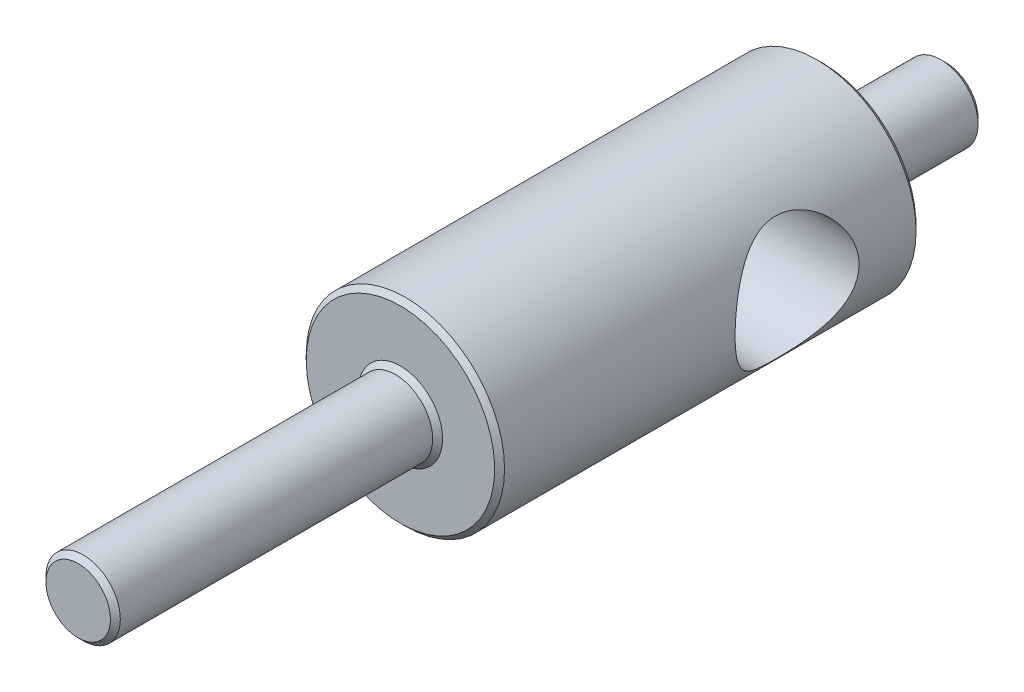
ISO-10303-21;
HEADER;
FILE_DESCRIPTION(('STEP AP214'),'2;1');
FILE_NAME('part.step','',(''),(''),'','','');
FILE_SCHEMA(('AUTOMOTIVE_DESIGN { 1 0 10303 214 1 1 1 1 }'));
ENDSEC;
DATA;
#1=APPLICATION_CONTEXT('core data for automotive mechanical design processes');
#2=APPLICATION_PROTOCOL_DEFINITION('international standard','automotive_design',2000,#1);
#3=PRODUCT_CONTEXT('',#1,'mechanical');
#4=PRODUCT('Part','Part','',(#3));
#5=PRODUCT_RELATED_PRODUCT_CATEGORY('part','',(#4));
#6=PRODUCT_DEFINITION_FORMATION('','',#4);
#7=PRODUCT_DEFINITION_CONTEXT('part definition',#1,'design');
#8=PRODUCT_DEFINITION('design','',#6,#7);
#9=PRODUCT_DEFINITION_SHAPE('','',#8);
#10=(LENGTH_UNIT() NAMED_UNIT(*) SI_UNIT(.MILLI.,.METRE.));
#11=(NAMED_UNIT(*) PLANE_ANGLE_UNIT() SI_UNIT($,.RADIAN.));
#12=(NAMED_UNIT(*) SI_UNIT($,.STERADIAN.) SOLID_ANGLE_UNIT());
#13=UNCERTAINTY_MEASURE_WITH_UNIT(LENGTH_MEASURE(1.E-05),#10,'distance_accuracy_value','');
#14=(GEOMETRIC_REPRESENTATION_CONTEXT(3) GLOBAL_UNCERTAINTY_ASSIGNED_CONTEXT((#13)) GLOBAL_UNIT_ASSIGNED_CONTEXT((#10,
#11,#12)) REPRESENTATION_CONTEXT('',''));
#15=CARTESIAN_POINT('',(0.,0.,0.));
#16=DIRECTION('',(0.,0.,1.));
#17=DIRECTION('',(1.,0.,0.));
#18=AXIS2_PLACEMENT_3D('',#15,#16,#17);
#19=CARTESIAN_POINT('',(0.,0.,-13.));
#20=DIRECTION('',(0.,0.,1.));
#21=DIRECTION('',(1.,0.,0.));
#22=AXIS2_PLACEMENT_3D('',#19,#20,#21);
#23=CYLINDRICAL_SURFACE('',#22,1.5);
#24=CARTESIAN_POINT('',(0.,0.,-12.8));
#25=DIRECTION('',(0.,0.,-1.));
#26=DIRECTION('',(-1.,0.,0.));
#27=AXIS2_PLACEMENT_3D('',#24,#25,#26);
#28=CIRCLE('',#27,1.5);
#29=CARTESIAN_POINT('',(1.5,0.,-12.8));
#30=VERTEX_POINT('',#29);
#31=EDGE_CURVE('E53',#30,#30,#28,.F.);
#32=CARTESIAN_POINT('',(0.,0.,-0.199999999999985));
#33=DIRECTION('',(0.,0.,1.));
#34=DIRECTION('',(1.,0.,0.));
#35=AXIS2_PLACEMENT_3D('',#32,#33,#34);
#36=CIRCLE('',#35,1.5);
#37=CARTESIAN_POINT('',(1.5,0.,-0.199999999999985));
#38=VERTEX_POINT('',#37);
#39=EDGE_CURVE('E58',#38,#38,#36,.F.);
#40=CARTESIAN_POINT('',(1.5,0.,-12.8));
#41=CARTESIAN_POINT('',(1.5,0.,-12.66875));
#42=CARTESIAN_POINT('',(1.5,0.,-12.5375));
#43=CARTESIAN_POINT('',(1.5,0.,-12.275));
#44=CARTESIAN_POINT('',(1.5,0.,-12.14375));
#45=CARTESIAN_POINT('',(1.5,0.,-11.88125));
#46=CARTESIAN_POINT('',(1.5,0.,-11.75));
#47=CARTESIAN_POINT('',(1.5,0.,-11.4875));
#48=CARTESIAN_POINT('',(1.5,0.,-11.35625));
#49=CARTESIAN_POINT('',(1.5,0.,-11.09375));
#50=CARTESIAN_POINT('',(1.5,0.,-10.9625));
#51=CARTESIAN_POINT('',(1.5,0.,-10.7));
#52=CARTESIAN_POINT('',(1.5,0.,-10.56875));
#53=CARTESIAN_POINT('',(1.5,0.,-10.30625));
#54=CARTESIAN_POINT('',(1.5,0.,-10.175));
#55=CARTESIAN_POINT('',(1.5,0.,-9.91249999999999));
#56=CARTESIAN_POINT('',(1.5,0.,-9.78124999999998));
#57=CARTESIAN_POINT('',(1.5,0.,-9.51874999999998));
#58=CARTESIAN_POINT('',(1.5,0.,-9.38749999999999));
#59=CARTESIAN_POINT('',(1.5,0.,-9.12499999999999));
#60=CARTESIAN_POINT('',(1.5,0.,-8.99374999999998));
#61=CARTESIAN_POINT('',(1.5,0.,-8.73124999999999));
#62=CARTESIAN_POINT('',(1.5,0.,-8.59999999999999));
#63=CARTESIAN_POINT('',(1.5,0.,-8.33749999999999));
#64=CARTESIAN_POINT('',(1.5,0.,-8.20624999999999));
#65=CARTESIAN_POINT('',(1.5,0.,-7.94374999999999));
#66=CARTESIAN_POINT('',(1.5,0.,-7.81249999999998));
#67=CARTESIAN_POINT('',(1.5,0.,-7.54999999999998));
#68=CARTESIAN_POINT('',(1.5,0.,-7.41874999999999));
#69=CARTESIAN_POINT('',(1.5,0.,-7.15624999999998));
#70=CARTESIAN_POINT('',(1.5,0.,-7.02499999999999));
#71=CARTESIAN_POINT('',(1.5,0.,-6.76249999999999));
#72=CARTESIAN_POINT('',(1.5,0.,-6.63124999999999));
#73=CARTESIAN_POINT('',(1.5,0.,-6.36874999999998));
#74=CARTESIAN_POINT('',(1.5,0.,-6.23749999999999));
#75=CARTESIAN_POINT('',(1.5,0.,-5.97499999999998));
#76=CARTESIAN_POINT('',(1.5,0.,-5.84374999999998));
#77=CARTESIAN_POINT('',(1.5,0.,-5.58124999999998));
#78=CARTESIAN_POINT('',(1.5,0.,-5.44999999999999));
#79=CARTESIAN_POINT('',(1.5,0.,-5.18749999999998));
#80=CARTESIAN_POINT('',(1.5,0.,-5.05624999999999));
#81=CARTESIAN_POINT('',(1.5,0.,-4.79374999999999));
#82=CARTESIAN_POINT('',(1.5,0.,-4.66249999999999));
#83=CARTESIAN_POINT('',(1.5,0.,-4.39999999999999));
#84=CARTESIAN_POINT('',(1.5,0.,-4.26874999999999));
#85=CARTESIAN_POINT('',(1.5,0.,-4.00624999999999));
#86=CARTESIAN_POINT('',(1.5,0.,-3.87499999999999));
#87=CARTESIAN_POINT('',(1.5,0.,-3.61249999999999));
#88=CARTESIAN_POINT('',(1.5,0.,-3.48124999999999));
#89=CARTESIAN_POINT('',(1.5,0.,-3.21874999999998));
#90=CARTESIAN_POINT('',(1.5,0.,-3.08749999999998));
#91=CARTESIAN_POINT('',(1.5,0.,-2.82499999999998));
#92=CARTESIAN_POINT('',(1.5,0.,-2.69374999999998));
#93=CARTESIAN_POINT('',(1.5,0.,-2.43124999999998));
#94=CARTESIAN_POINT('',(1.5,0.,-2.29999999999998));
#95=CARTESIAN_POINT('',(1.5,0.,-2.03749999999998));
#96=CARTESIAN_POINT('',(1.5,0.,-1.90624999999998));
#97=CARTESIAN_POINT('',(1.5,0.,-1.64374999999998));
#98=CARTESIAN_POINT('',(1.5,0.,-1.51249999999998));
#99=CARTESIAN_POINT('',(1.5,0.,-1.24999999999998));
#100=CARTESIAN_POINT('',(1.5,0.,-1.11874999999998));
#101=CARTESIAN_POINT('',(1.5,0.,-0.856249999999984));
#102=CARTESIAN_POINT('',(1.5,0.,-0.724999999999984));
#103=CARTESIAN_POINT('',(1.5,0.,-0.462499999999984));
#104=CARTESIAN_POINT('',(1.5,0.,-0.331249999999984));
#105=CARTESIAN_POINT('',(1.5,0.,-0.199999999999985));
#106=B_SPLINE_CURVE_WITH_KNOTS('',3,(#40,#41,#42,#43,#44,#45,#46,#47,#48,#49,#50,#51,#52,#53,
#54,#55,#56,#57,#58,#59,#60,#61,#62,#63,#64,#65,#66,#67,#68,#69,#70,#71,#72,#73,#74,#75,#76,#77,
#78,#79,#80,#81,#82,#83,#84,#85,#86,#87,#88,#89,#90,#91,#92,#93,#94,#95,#96,#97,#98,#99,#100,
#101,#102,#103,#104,#105),.UNSPECIFIED.,.F.,.F.,(4,2,2,2,2,2,2,2,2,2,2,2,2,2,2,2,2,2,2,2,2,2,2,
2,2,2,2,2,2,2,2,2,4),(0.,0.39375,0.787500000000002,1.18125,1.575,1.96875,2.3625,2.75625,3.15,
3.54375,3.9375,4.33125,4.725,5.11875,5.5125,5.90625,6.3,6.69375,7.0875,7.48125,7.875,8.26875,
8.6625,9.05625,9.45,9.84375,10.2375,10.63125,11.025,11.41875,11.8125,12.20625,12.6),.UNSPECIFIED.);
#107=EDGE_CURVE('BSEAM37',#30,#38,#106,.T.);
#108=ORIENTED_EDGE('',*,*,#31,.T.);
#109=ORIENTED_EDGE('',*,*,#39,.T.);
#110=ORIENTED_EDGE('',*,*,#107,.T.);
#111=ORIENTED_EDGE('',*,*,#107,.F.);
#112=EDGE_LOOP('',(#108,#110,#109,#111));
#113=FACE_BOUND('',#112,.T.);
#114=ADVANCED_FACE('F37',(#113),#23,.T.);
#115=CARTESIAN_POINT('',(0.,0.,0.));
#116=DIRECTION('',(0.,0.,1.));
#117=DIRECTION('',(1.,0.,0.));
#118=AXIS2_PLACEMENT_3D('',#115,#116,#117);
#119=PLANE('',#118);
#120=CARTESIAN_POINT('',(0.,0.,0.));
#121=DIRECTION('',(0.,0.,1.));
#122=DIRECTION('',(1.,0.,0.));
#123=AXIS2_PLACEMENT_3D('',#120,#121,#122);
#124=CIRCLE('',#123,1.30000000000002);
#125=CARTESIAN_POINT('',(1.30000000000002,0.,0.));
#126=VERTEX_POINT('',#125);
#127=EDGE_CURVE('E10',#126,#126,#124,.T.);
#128=ORIENTED_EDGE('',*,*,#127,.T.);
#129=EDGE_LOOP('',(#128));
#130=FACE_BOUND('',#129,.T.);
#131=ADVANCED_FACE('F122',(#130),#119,.T.);
#132=CARTESIAN_POINT('',(0.,0.,-30.));
#133=DIRECTION('',(0.,0.,1.));
#134=DIRECTION('',(1.,0.,0.));
#135=AXIS2_PLACEMENT_3D('',#132,#133,#134);
#136=CYLINDRICAL_SURFACE('',#135,4.);
#137=CARTESIAN_POINT('',(0.,0.,-29.8));
#138=DIRECTION('',(0.,0.,-1.));
#139=DIRECTION('',(-1.,0.,0.));
#140=AXIS2_PLACEMENT_3D('',#137,#138,#139);
#141=CIRCLE('',#140,4.);
#142=CARTESIAN_POINT('',(-4.,0.,-29.8));
#143=VERTEX_POINT('',#142);
#144=EDGE_CURVE('E61',#143,#143,#141,.F.);
#145=ORIENTED_EDGE('',*,*,#144,.T.);
#146=EDGE_LOOP('',(#145));
#147=FACE_BOUND('',#146,.T.);
#148=CARTESIAN_POINT('',(0.,0.,-13.2));
#149=DIRECTION('',(0.,0.,-1.));
#150=DIRECTION('',(-1.,0.,0.));
#151=AXIS2_PLACEMENT_3D('',#148,#149,#150);
#152=CIRCLE('',#151,4.);
#153=CARTESIAN_POINT('',(-4.,0.,-13.2));
#154=VERTEX_POINT('',#153);
#155=EDGE_CURVE('E64',#154,#154,#152,.T.);
#156=ORIENTED_EDGE('',*,*,#155,.T.);
#157=EDGE_LOOP('',(#156));
#158=FACE_BOUND('',#157,.T.);
#159=CARTESIAN_POINT('',(-4.,0.,-27.5));
#160=CARTESIAN_POINT('',(-3.99999041333571,0.127017476559871,-27.4999895238564));
#161=CARTESIAN_POINT('',(-3.9938860659399,0.254191951791703,-27.4902535000983));
#162=CARTESIAN_POINT('',(-3.97004375552586,0.504637456621344,-27.4518288703157));
#163=CARTESIAN_POINT('',(-3.95228361873137,0.627900575825985,-27.4231041397388));
#164=CARTESIAN_POINT('',(-3.90691695293563,0.866410868269161,-27.3483771467125));
#165=CARTESIAN_POINT('',(-3.87935918690877,0.98169442070943,-27.3024603902124));
#166=CARTESIAN_POINT('',(-3.81669199838277,1.20252080434994,-27.1952283325085));
#167=CARTESIAN_POINT('',(-3.7815834126609,1.30806471304098,-27.1339147374469));
#168=CARTESIAN_POINT('',(-3.70340304945466,1.51594836437078,-26.9922268434089));
#169=CARTESIAN_POINT('',(-3.65991924217889,1.61735911616791,-26.9107213972982));
#170=CARTESIAN_POINT('',(-3.57062700058922,1.80597275567284,-26.7335616537415));
#171=CARTESIAN_POINT('',(-3.52481549782957,1.89315621594405,-26.6378883442611));
#172=CARTESIAN_POINT('',(-3.42860837235627,2.06285746302521,-26.4199322107088));
#173=CARTESIAN_POINT('',(-3.37843221966147,2.14314412018317,-26.2958004265691));
#174=CARTESIAN_POINT('',(-3.28660396278105,2.28147932079995,-26.0328703693216));
#175=CARTESIAN_POINT('',(-3.2449375200046,2.33956541787438,-25.894097374832));
#176=CARTESIAN_POINT('',(-3.18619151248815,2.41866801180576,-25.6423789524543));
#177=CARTESIAN_POINT('',(-3.16553811970886,2.44539104794679,-25.5320663630817));
#178=CARTESIAN_POINT('',(-3.1356271466086,2.4836368711914,-25.3073881486193));
#179=CARTESIAN_POINT('',(-3.12635347378457,2.49518112485637,-25.1930284828268));
#180=CARTESIAN_POINT('',(-3.12059771534501,2.50237836690497,-24.9631739671236));
#181=CARTESIAN_POINT('',(-3.12414917427958,2.49798968200884,-24.847676929422));
#182=CARTESIAN_POINT('',(-3.14354804883411,2.47352633347829,-24.6193797912734));
#183=CARTESIAN_POINT('',(-3.15940531965489,2.45343909745149,-24.5065819271501));
#184=CARTESIAN_POINT('',(-3.20065145822146,2.3993620946426,-24.2891231032564));
#185=CARTESIAN_POINT('',(-3.22581428653572,2.36570043522604,-24.1843351202826));
#186=CARTESIAN_POINT('',(-3.28291134443418,2.28580369589507,-23.9816776035268));
#187=CARTESIAN_POINT('',(-3.31484796808523,2.2395641689404,-23.8838105321565));
#188=CARTESIAN_POINT('',(-3.38909625095658,2.12589830407261,-23.6783335924898));
#189=CARTESIAN_POINT('',(-3.4322315520855,2.05612773657747,-23.5723189481476));
#190=CARTESIAN_POINT('',(-3.52011451554715,1.90176111958637,-23.3723388730236));
#191=CARTESIAN_POINT('',(-3.56486379714022,1.81714983251341,-23.2783859999549));
#192=CARTESIAN_POINT('',(-3.65959667460597,1.61904732877734,-23.0893989904174));
#193=CARTESIAN_POINT('',(-3.70922571443728,1.50309447420017,-22.9967440572784));
#194=CARTESIAN_POINT('',(-3.8005660184067,1.25426444468514,-22.832288206369));
#195=CARTESIAN_POINT('',(-3.84228039228673,1.12139395127005,-22.7604790921905));
#196=CARTESIAN_POINT('',(-3.89435975869902,0.915775751567442,-22.672654043365));
#197=CARTESIAN_POINT('',(-3.90966874385268,0.848193583187394,-22.6471657135696));
#198=CARTESIAN_POINT('',(-3.93701839875445,0.710492049478447,-22.6019923495214));
#199=CARTESIAN_POINT('',(-3.94906095588034,0.6403741759679,-22.5823039634292));
#200=CARTESIAN_POINT('',(-3.96949699527849,0.498239019538474,-22.5490658383576));
#201=CARTESIAN_POINT('',(-3.97789374843884,0.426223500915278,-22.535510596474));
#202=CARTESIAN_POINT('',(-3.99078766491331,0.280965673560735,-22.5147537066864));
#203=CARTESIAN_POINT('',(-3.99528549435853,0.207723576570754,-22.5075509734527));
#204=CARTESIAN_POINT('',(-4.00193773474167,0.00911917689680851,-22.4968906953565));
#205=CARTESIAN_POINT('',(-4.000238122366,-0.116782016705692,-22.4995996368765));
#206=CARTESIAN_POINT('',(-3.98518313408306,-0.365967766011664,-22.5237596644654));
#207=CARTESIAN_POINT('',(-3.97182855210102,-0.489252499359947,-22.5452094739247));
#208=CARTESIAN_POINT('',(-3.93547975555369,-0.725036194002597,-22.6044785879828));
#209=CARTESIAN_POINT('',(-3.91288306371127,-0.837768421062908,-22.6416247207698));
#210=CARTESIAN_POINT('',(-3.85991402897874,-1.05527816125331,-22.7305923713124));
#211=CARTESIAN_POINT('',(-3.82954038411642,-1.16005433861599,-22.7824163465014));
#212=CARTESIAN_POINT('',(-3.75980014020658,-1.37016761969194,-22.9050305375078));
#213=CARTESIAN_POINT('',(-3.71983526755373,-1.47449380296905,-22.977207172275));
#214=CARTESIAN_POINT('',(-3.63613942885727,-1.67028541330073,-23.1355876964693));
#215=CARTESIAN_POINT('',(-3.59240430473134,-1.76173634038025,-23.2218071688857));
#216=CARTESIAN_POINT('',(-3.49811738486729,-1.94294835276253,-23.4202700898457));
#217=CARTESIAN_POINT('',(-3.44749766579192,-2.03053702733637,-23.5344744154975));
#218=CARTESIAN_POINT('',(-3.35133525746893,-2.18560704916439,-23.7777515669826));
#219=CARTESIAN_POINT('',(-3.3057890670837,-2.25310231693768,-23.9068140128913));
#220=CARTESIAN_POINT('',(-3.2346706057884,-2.35369543821018,-24.1493842965996));
#221=CARTESIAN_POINT('',(-3.20691272363805,-2.39103791720685,-24.2604815013887));
#222=CARTESIAN_POINT('',(-3.16210061351252,-2.45000216420747,-24.4887862916134));
#223=CARTESIAN_POINT('',(-3.1450296652982,-2.47164849805251,-24.6059840196894));
#224=CARTESIAN_POINT('',(-3.124126499326,-2.49802767469226,-24.8441805529704));
#225=CARTESIAN_POINT('',(-3.12037003193165,-2.50266374586469,-24.9651971678799));
#226=CARTESIAN_POINT('',(-3.12698126375719,-2.49439556773531,-25.2062619238295));
#227=CARTESIAN_POINT('',(-3.13735365770479,-2.48148548821457,-25.3263097296194));
#228=CARTESIAN_POINT('',(-3.16910777009989,-2.44076547086104,-25.5520595794361));
#229=CARTESIAN_POINT('',(-3.18953614189074,-2.41423847191721,-25.6581385645024));
#230=CARTESIAN_POINT('',(-3.23835062785226,-2.34835238743426,-25.8642701575182));
#231=CARTESIAN_POINT('',(-3.26674005971309,-2.30898795090781,-25.9643202318173));
#232=CARTESIAN_POINT('',(-3.33327797617852,-2.21205415803959,-26.1711933243381));
#233=CARTESIAN_POINT('',(-3.3722442852408,-2.15267427981667,-26.2768999462637));
#234=CARTESIAN_POINT('',(-3.45335445323995,-2.01999894889208,-26.4778773857092));
#235=CARTESIAN_POINT('',(-3.49550086438999,-1.94669224594686,-26.5731396673741));
#236=CARTESIAN_POINT('',(-3.58803675426846,-1.77134669685942,-26.7700255837984));
#237=CARTESIAN_POINT('',(-3.63840488260278,-1.66649284489893,-26.8691697615393));
#238=CARTESIAN_POINT('',(-3.7339805383823,-1.43961937990849,-27.049001596125));
#239=CARTESIAN_POINT('',(-3.77918486147258,-1.31758921196651,-27.1296778236775));
#240=CARTESIAN_POINT('',(-3.83959214728415,-1.12346357942551,-27.2345634385587));
#241=CARTESIAN_POINT('',(-3.85851834157057,-1.05679601158095,-27.266874800047));
#242=CARTESIAN_POINT('',(-3.89335165397882,-0.920199584374069,-27.3256722518238));
#243=CARTESIAN_POINT('',(-3.9092605122592,-0.850272633931991,-27.3521617011351));
#244=CARTESIAN_POINT('',(-3.93753374175517,-0.707873688437773,-27.3988571444622));
#245=CARTESIAN_POINT('',(-3.94990764965183,-0.635409144572272,-27.4190800572457));
#246=CARTESIAN_POINT('',(-3.97075677458059,-0.488456989557123,-27.4529754555824));
#247=CARTESIAN_POINT('',(-3.97923486692923,-0.413970913545536,-27.4666527724395));
#248=CARTESIAN_POINT('',(-3.99038271291772,-0.282852605094056,-27.4845904102267));
#249=CARTESIAN_POINT('',(-3.99398159517595,-0.226501515914873,-27.4903615302522));
#250=CARTESIAN_POINT('',(-3.99879245372932,-0.113444074519048,-27.4980687836271));
#251=CARTESIAN_POINT('',(-4.00000428228699,-0.0567377005313063,-27.5000046796104));
#252=CARTESIAN_POINT('',(-4.,0.,-27.5));
#253=B_SPLINE_CURVE_WITH_KNOTS('',3,(#159,#160,#161,#162,#163,#164,#165,#166,#167,#168,#169,
#170,#171,#172,#173,#174,#175,#176,#177,#178,#179,#180,#181,#182,#183,#184,#185,#186,#187,#188,
#189,#190,#191,#192,#193,#194,#195,#196,#197,#198,#199,#200,#201,#202,#203,#204,#205,#206,#207,
#208,#209,#210,#211,#212,#213,#214,#215,#216,#217,#218,#219,#220,#221,#222,#223,#224,#225,#226,
#227,#228,#229,#230,#231,#232,#233,#234,#235,#236,#237,#238,#239,#240,#241,#242,#243,#244,#245,
#246,#247,#248,#249,#250,#251,#252),.UNSPECIFIED.,.T.,.F.,(4,2,2,2,2,2,2,2,2,2,2,2,2,2,2,2,2,2,
2,2,2,2,2,2,2,2,2,2,2,2,2,2,2,2,2,2,2,2,2,2,2,2,2,2,2,2,4),(0.,0.380824602868266,
0.762375788256923,1.14205397519027,1.52169010807759,1.93164374107244,2.34215256651403,
2.80825951705947,3.27357449214021,3.61824017759434,3.96241789414781,4.30749646997556,
4.65285169010166,4.99031678920872,5.32790135816065,5.72854900708719,6.12961045150363,
6.59684361399043,7.06389281455722,7.28510978359955,7.50619865744382,7.72708876613707,
7.94794112831292,8.32363778110177,8.69930884379592,9.06028425977628,9.42132014771964,
9.81879878896136,10.216721545704,10.6724083464246,11.1277787130885,11.4876929754247,
11.8470427174174,12.2084336629143,12.5699447204276,12.9023575499051,13.2349091154192,
13.6156046298899,13.9966089922257,14.4531049498525,14.9098826607203,15.138984863948,
15.3679545348469,15.5963005225022,15.8244777070605,15.994578512822,16.1646898459841),.UNSPECIFIED.);
#254=CARTESIAN_POINT('',(-4.,0.,-27.5));
#255=VERTEX_POINT('',#254);
#256=EDGE_CURVE('E82',#255,#255,#253,.T.);
#257=ORIENTED_EDGE('',*,*,#256,.T.);
#258=EDGE_LOOP('',(#257));
#259=FACE_BOUND('',#258,.T.);
#260=CARTESIAN_POINT('',(4.,0.,-27.5));
#261=CARTESIAN_POINT('',(3.99999041333571,-0.127017476559871,-27.4999895238564));
#262=CARTESIAN_POINT('',(3.9938860659399,-0.254191951791703,-27.4902535000983));
#263=CARTESIAN_POINT('',(3.97004375552586,-0.504637456621344,-27.4518288703157));
#264=CARTESIAN_POINT('',(3.95228361873137,-0.627900575825985,-27.4231041397388));
#265=CARTESIAN_POINT('',(3.90691695293563,-0.866410868269161,-27.3483771467125));
#266=CARTESIAN_POINT('',(3.87935918690877,-0.98169442070943,-27.3024603902124));
#267=CARTESIAN_POINT('',(3.81669199838277,-1.20252080434994,-27.1952283325085));
#268=CARTESIAN_POINT('',(3.7815834126609,-1.30806471304098,-27.1339147374469));
#269=CARTESIAN_POINT('',(3.70340304945466,-1.51594836437078,-26.9922268434089));
#270=CARTESIAN_POINT('',(3.65991924217889,-1.61735911616791,-26.9107213972982));
#271=CARTESIAN_POINT('',(3.57062700058922,-1.80597275567284,-26.7335616537415));
#272=CARTESIAN_POINT('',(3.52481549782957,-1.89315621594405,-26.6378883442611));
#273=CARTESIAN_POINT('',(3.42860837235627,-2.06285746302521,-26.4199322107088));
#274=CARTESIAN_POINT('',(3.37843221966147,-2.14314412018317,-26.2958004265691));
#275=CARTESIAN_POINT('',(3.28660396278105,-2.28147932079995,-26.0328703693216));
#276=CARTESIAN_POINT('',(3.2449375200046,-2.33956541787438,-25.894097374832));
#277=CARTESIAN_POINT('',(3.18619151248815,-2.41866801180576,-25.6423789524543));
#278=CARTESIAN_POINT('',(3.16553811970886,-2.44539104794679,-25.5320663630817));
#279=CARTESIAN_POINT('',(3.1356271466086,-2.4836368711914,-25.3073881486193));
#280=CARTESIAN_POINT('',(3.12635347378457,-2.49518112485637,-25.1930284828268));
#281=CARTESIAN_POINT('',(3.12059771534501,-2.50237836690497,-24.9631739671236));
#282=CARTESIAN_POINT('',(3.12414917427958,-2.49798968200884,-24.847676929422));
#283=CARTESIAN_POINT('',(3.14354804883411,-2.47352633347829,-24.6193797912734));
#284=CARTESIAN_POINT('',(3.15940531965489,-2.45343909745149,-24.5065819271501));
#285=CARTESIAN_POINT('',(3.20065145822146,-2.3993620946426,-24.2891231032564));
#286=CARTESIAN_POINT('',(3.22581428653572,-2.36570043522604,-24.1843351202826));
#287=CARTESIAN_POINT('',(3.28291134443418,-2.28580369589507,-23.9816776035268));
#288=CARTESIAN_POINT('',(3.31484796808523,-2.2395641689404,-23.8838105321565));
#289=CARTESIAN_POINT('',(3.38909625095658,-2.12589830407261,-23.6783335924898));
#290=CARTESIAN_POINT('',(3.4322315520855,-2.05612773657747,-23.5723189481476));
#291=CARTESIAN_POINT('',(3.52011451554715,-1.90176111958637,-23.3723388730236));
#292=CARTESIAN_POINT('',(3.56486379714022,-1.81714983251341,-23.2783859999549));
#293=CARTESIAN_POINT('',(3.65959667460597,-1.61904732877734,-23.0893989904174));
#294=CARTESIAN_POINT('',(3.70922571443728,-1.50309447420017,-22.9967440572784));
#295=CARTESIAN_POINT('',(3.8005660184067,-1.25426444468514,-22.832288206369));
#296=CARTESIAN_POINT('',(3.84228039228673,-1.12139395127005,-22.7604790921905));
#297=CARTESIAN_POINT('',(3.89435975869902,-0.915775751567442,-22.672654043365));
#298=CARTESIAN_POINT('',(3.90966874385268,-0.848193583187394,-22.6471657135696));
#299=CARTESIAN_POINT('',(3.93701839875445,-0.710492049478447,-22.6019923495214));
#300=CARTESIAN_POINT('',(3.94906095588034,-0.6403741759679,-22.5823039634292));
#301=CARTESIAN_POINT('',(3.96949699527849,-0.498239019538474,-22.5490658383576));
#302=CARTESIAN_POINT('',(3.97789374843884,-0.426223500915278,-22.535510596474));
#303=CARTESIAN_POINT('',(3.99078766491331,-0.280965673560735,-22.5147537066864));
#304=CARTESIAN_POINT('',(3.99528549435853,-0.207723576570754,-22.5075509734527));
#305=CARTESIAN_POINT('',(4.00193773474167,-0.00911917689680851,-22.4968906953565));
#306=CARTESIAN_POINT('',(4.000238122366,0.116782016705692,-22.4995996368765));
#307=CARTESIAN_POINT('',(3.98518313408306,0.365967766011664,-22.5237596644654));
#308=CARTESIAN_POINT('',(3.97182855210102,0.489252499359947,-22.5452094739247));
#309=CARTESIAN_POINT('',(3.93547975555369,0.725036194002597,-22.6044785879828));
#310=CARTESIAN_POINT('',(3.91288306371127,0.837768421062908,-22.6416247207698));
#311=CARTESIAN_POINT('',(3.85991402897874,1.05527816125331,-22.7305923713124));
#312=CARTESIAN_POINT('',(3.82954038411642,1.16005433861599,-22.7824163465014));
#313=CARTESIAN_POINT('',(3.75980014020658,1.37016761969194,-22.9050305375078));
#314=CARTESIAN_POINT('',(3.71983526755373,1.47449380296905,-22.977207172275));
#315=CARTESIAN_POINT('',(3.63613942885727,1.67028541330073,-23.1355876964693));
#316=CARTESIAN_POINT('',(3.59240430473134,1.76173634038025,-23.2218071688857));
#317=CARTESIAN_POINT('',(3.49811738486729,1.94294835276253,-23.4202700898457));
#318=CARTESIAN_POINT('',(3.44749766579192,2.03053702733637,-23.5344744154975));
#319=CARTESIAN_POINT('',(3.35133525746893,2.18560704916439,-23.7777515669826));
#320=CARTESIAN_POINT('',(3.3057890670837,2.25310231693768,-23.9068140128913));
#321=CARTESIAN_POINT('',(3.2346706057884,2.35369543821018,-24.1493842965996));
#322=CARTESIAN_POINT('',(3.20691272363805,2.39103791720685,-24.2604815013887));
#323=CARTESIAN_POINT('',(3.16210061351252,2.45000216420747,-24.4887862916134));
#324=CARTESIAN_POINT('',(3.1450296652982,2.47164849805251,-24.6059840196894));
#325=CARTESIAN_POINT('',(3.124126499326,2.49802767469226,-24.8441805529704));
#326=CARTESIAN_POINT('',(3.12037003193165,2.50266374586469,-24.9651971678799));
#327=CARTESIAN_POINT('',(3.12698126375719,2.49439556773531,-25.2062619238295));
#328=CARTESIAN_POINT('',(3.13735365770479,2.48148548821457,-25.3263097296194));
#329=CARTESIAN_POINT('',(3.16910777009989,2.44076547086104,-25.5520595794361));
#330=CARTESIAN_POINT('',(3.18953614189074,2.41423847191721,-25.6581385645024));
#331=CARTESIAN_POINT('',(3.23835062785226,2.34835238743426,-25.8642701575182));
#332=CARTESIAN_POINT('',(3.26674005971309,2.30898795090781,-25.9643202318173));
#333=CARTESIAN_POINT('',(3.33327797617852,2.21205415803959,-26.1711933243381));
#334=CARTESIAN_POINT('',(3.3722442852408,2.15267427981667,-26.2768999462637));
#335=CARTESIAN_POINT('',(3.45335445323995,2.01999894889208,-26.4778773857092));
#336=CARTESIAN_POINT('',(3.49550086438999,1.94669224594686,-26.5731396673741));
#337=CARTESIAN_POINT('',(3.58803675426846,1.77134669685942,-26.7700255837984));
#338=CARTESIAN_POINT('',(3.63840488260278,1.66649284489893,-26.8691697615393));
#339=CARTESIAN_POINT('',(3.7339805383823,1.43961937990849,-27.049001596125));
#340=CARTESIAN_POINT('',(3.77918486147258,1.31758921196651,-27.1296778236775));
#341=CARTESIAN_POINT('',(3.83959214728415,1.12346357942551,-27.2345634385587));
#342=CARTESIAN_POINT('',(3.85851834157057,1.05679601158095,-27.266874800047));
#343=CARTESIAN_POINT('',(3.89335165397882,0.920199584374069,-27.3256722518238));
#344=CARTESIAN_POINT('',(3.9092605122592,0.850272633931991,-27.3521617011351));
#345=CARTESIAN_POINT('',(3.93753374175517,0.707873688437773,-27.3988571444622));
#346=CARTESIAN_POINT('',(3.94990764965183,0.635409144572272,-27.4190800572457));
#347=CARTESIAN_POINT('',(3.97075677458059,0.488456989557123,-27.4529754555824));
#348=CARTESIAN_POINT('',(3.97923486692923,0.413970913545536,-27.4666527724395));
#349=CARTESIAN_POINT('',(3.99038271291772,0.282852605094056,-27.4845904102267));
#350=CARTESIAN_POINT('',(3.99398159517595,0.226501515914873,-27.4903615302522));
#351=CARTESIAN_POINT('',(3.99879245372932,0.113444074519048,-27.4980687836271));
#352=CARTESIAN_POINT('',(4.00000428228699,0.0567377005313063,-27.5000046796104));
#353=CARTESIAN_POINT('',(4.,0.,-27.5));
#354=B_SPLINE_CURVE_WITH_KNOTS('',3,(#260,#261,#262,#263,#264,#265,#266,#267,#268,#269,#270,
#271,#272,#273,#274,#275,#276,#277,#278,#279,#280,#281,#282,#283,#284,#285,#286,#287,#288,#289,
#290,#291,#292,#293,#294,#295,#296,#297,#298,#299,#300,#301,#302,#303,#304,#305,#306,#307,#308,
#309,#310,#311,#312,#313,#314,#315,#316,#317,#318,#319,#320,#321,#322,#323,#324,#325,#326,#327,
#328,#329,#330,#331,#332,#333,#334,#335,#336,#337,#338,#339,#340,#341,#342,#343,#344,#345,#346,
#347,#348,#349,#350,#351,#352,#353),.UNSPECIFIED.,.T.,.F.,(4,2,2,2,2,2,2,2,2,2,2,2,2,2,2,2,2,2,
2,2,2,2,2,2,2,2,2,2,2,2,2,2,2,2,2,2,2,2,2,2,2,2,2,2,2,2,4),(0.,0.380824602868266,
0.762375788256923,1.14205397519027,1.52169010807759,1.93164374107244,2.34215256651403,
2.80825951705947,3.27357449214021,3.61824017759434,3.96241789414781,4.30749646997556,
4.65285169010166,4.99031678920872,5.32790135816065,5.72854900708719,6.12961045150363,
6.59684361399043,7.06389281455722,7.28510978359955,7.50619865744382,7.72708876613707,
7.94794112831292,8.32363778110177,8.69930884379592,9.06028425977628,9.42132014771964,
9.81879878896136,10.216721545704,10.6724083464246,11.1277787130885,11.4876929754247,
11.8470427174174,12.2084336629143,12.5699447204276,12.9023575499051,13.2349091154192,
13.6156046298899,13.9966089922257,14.4531049498525,14.9098826607203,15.138984863948,
15.3679545348469,15.5963005225022,15.8244777070605,15.994578512822,16.1646898459841),.UNSPECIFIED.);
#355=CARTESIAN_POINT('',(4.,0.,-27.5));
#356=VERTEX_POINT('',#355);
#357=EDGE_CURVE('E90',#356,#356,#354,.T.);
#358=ORIENTED_EDGE('',*,*,#357,.T.);
#359=EDGE_LOOP('',(#358));
#360=FACE_BOUND('',#359,.T.);
#361=ADVANCED_FACE('F94',(#147,#158,#259,#360),#136,.T.);
#362=CARTESIAN_POINT('',(0.,0.,-30.));
#363=DIRECTION('',(0.,0.,-1.));
#364=DIRECTION('',(-1.,0.,0.));
#365=AXIS2_PLACEMENT_3D('',#362,#363,#364);
#366=PLANE('',#365);
#367=CARTESIAN_POINT('',(0.,0.,-30.));
#368=DIRECTION('',(0.,0.,-1.));
#369=DIRECTION('',(-1.,0.,0.));
#370=AXIS2_PLACEMENT_3D('',#367,#368,#369);
#371=CIRCLE('',#370,1.7);
#372=CARTESIAN_POINT('',(-1.7,0.,-30.));
#373=VERTEX_POINT('',#372);
#374=EDGE_CURVE('E70',#373,#373,#371,.F.);
#375=ORIENTED_EDGE('',*,*,#374,.T.);
#376=EDGE_LOOP('',(#375));
#377=FACE_BOUND('',#376,.T.);
#378=CARTESIAN_POINT('',(0.,0.,-30.));
#379=DIRECTION('',(0.,0.,-1.));
#380=DIRECTION('',(-1.,0.,0.));
#381=AXIS2_PLACEMENT_3D('',#378,#379,#380);
#382=CIRCLE('',#381,3.8);
#383=CARTESIAN_POINT('',(-3.8,0.,-30.));
#384=VERTEX_POINT('',#383);
#385=EDGE_CURVE('E73',#384,#384,#382,.T.);
#386=ORIENTED_EDGE('',*,*,#385,.T.);
#387=EDGE_LOOP('',(#386));
#388=FACE_BOUND('',#387,.T.);
#389=ADVANCED_FACE('F114',(#377,#388),#366,.T.);
#390=CARTESIAN_POINT('',(0.,0.,-13.));
#391=DIRECTION('',(0.,0.,-1.));
#392=DIRECTION('',(-1.,0.,0.));
#393=AXIS2_PLACEMENT_3D('',#390,#391,#392);
#394=PLANE('',#393);
#395=CARTESIAN_POINT('',(0.,0.,-13.));
#396=DIRECTION('',(0.,0.,-1.));
#397=DIRECTION('',(-1.,0.,0.));
#398=AXIS2_PLACEMENT_3D('',#395,#396,#397);
#399=CIRCLE('',#398,1.70000000000001);
#400=CARTESIAN_POINT('',(-1.70000000000001,0.,-13.));
#401=VERTEX_POINT('',#400);
#402=EDGE_CURVE('E45',#401,#401,#399,.T.);
#403=ORIENTED_EDGE('',*,*,#402,.T.);
#404=EDGE_LOOP('',(#403));
#405=FACE_BOUND('',#404,.T.);
#406=CARTESIAN_POINT('',(0.,0.,-13.));
#407=DIRECTION('',(0.,0.,-1.));
#408=DIRECTION('',(-1.,0.,0.));
#409=AXIS2_PLACEMENT_3D('',#406,#407,#408);
#410=CIRCLE('',#409,3.80000000000001);
#411=CARTESIAN_POINT('',(-3.80000000000001,0.,-13.));
#412=VERTEX_POINT('',#411);
#413=EDGE_CURVE('E49',#412,#412,#410,.F.);
#414=ORIENTED_EDGE('',*,*,#413,.T.);
#415=EDGE_LOOP('',(#414));
#416=FACE_BOUND('',#415,.T.);
#417=ADVANCED_FACE('F112',(#405,#416),#394,.F.);
#418=CARTESIAN_POINT('',(0.,0.,-35.));
#419=DIRECTION('',(0.,0.,1.));
#420=DIRECTION('',(1.,0.,0.));
#421=AXIS2_PLACEMENT_3D('',#418,#419,#420);
#422=CYLINDRICAL_SURFACE('',#421,1.5);
#423=CARTESIAN_POINT('',(0.,0.,-30.2));
#424=DIRECTION('',(0.,0.,-1.));
#425=DIRECTION('',(-1.,0.,0.));
#426=AXIS2_PLACEMENT_3D('',#423,#424,#425);
#427=CIRCLE('',#426,1.5);
#428=CARTESIAN_POINT('',(-1.5,0.,-30.2));
#429=VERTEX_POINT('',#428);
#430=EDGE_CURVE('E76',#429,#429,#427,.T.);
#431=ORIENTED_EDGE('',*,*,#430,.T.);
#432=EDGE_LOOP('',(#431));
#433=FACE_BOUND('',#432,.T.);
#434=CARTESIAN_POINT('',(0.,0.,-34.8));
#435=DIRECTION('',(0.,0.,-1.));
#436=DIRECTION('',(-1.,0.,0.));
#437=AXIS2_PLACEMENT_3D('',#434,#435,#436);
#438=CIRCLE('',#437,1.5);
#439=CARTESIAN_POINT('',(-1.5,0.,-34.8));
#440=VERTEX_POINT('',#439);
#441=EDGE_CURVE('E79',#440,#440,#438,.F.);
#442=ORIENTED_EDGE('',*,*,#441,.T.);
#443=EDGE_LOOP('',(#442));
#444=FACE_BOUND('',#443,.T.);
#445=ADVANCED_FACE('F108',(#433,#444),#422,.T.);
#446=CARTESIAN_POINT('',(0.,0.,-35.));
#447=DIRECTION('',(0.,0.,-1.));
#448=DIRECTION('',(-1.,0.,0.));
#449=AXIS2_PLACEMENT_3D('',#446,#447,#448);
#450=PLANE('',#449);
#451=CARTESIAN_POINT('',(0.,0.,-35.));
#452=DIRECTION('',(0.,0.,-1.));
#453=DIRECTION('',(-1.,0.,0.));
#454=AXIS2_PLACEMENT_3D('',#451,#452,#453);
#455=CIRCLE('',#454,1.30000000000001);
#456=CARTESIAN_POINT('',(-1.30000000000001,0.,-35.));
#457=VERTEX_POINT('',#456);
#458=EDGE_CURVE('E67',#457,#457,#455,.T.);
#459=ORIENTED_EDGE('',*,*,#458,.T.);
#460=EDGE_LOOP('',(#459));
#461=FACE_BOUND('',#460,.T.);
#462=ADVANCED_FACE('F103',(#461),#450,.T.);
#463=CARTESIAN_POINT('',(-4.,0.,-25.));
#464=DIRECTION('',(1.,0.,0.));
#465=DIRECTION('',(0.,0.,-1.));
#466=AXIS2_PLACEMENT_3D('',#463,#464,#465);
#467=CYLINDRICAL_SURFACE('',#466,2.5);
#468=ORIENTED_EDGE('',*,*,#357,.F.);
#469=EDGE_LOOP('',(#468));
#470=FACE_BOUND('',#469,.T.);
#471=ORIENTED_EDGE('',*,*,#256,.F.);
#472=EDGE_LOOP('',(#471));
#473=FACE_BOUND('',#472,.T.);
#474=ADVANCED_FACE('F98',(#470,#473),#467,.F.);
#475=CARTESIAN_POINT('',(0.,0.,-30.2));
#476=DIRECTION('',(0.,0.,1.));
#477=DIRECTION('',(1.,0.,0.));
#478=AXIS2_PLACEMENT_3D('',#475,#476,#477);
#479=CONICAL_SURFACE('',#478,1.5,0.785398163397451);
#480=ORIENTED_EDGE('',*,*,#374,.F.);
#481=EDGE_LOOP('',(#480));
#482=FACE_BOUND('',#481,.T.);
#483=ORIENTED_EDGE('',*,*,#430,.F.);
#484=EDGE_LOOP('',(#483));
#485=FACE_BOUND('',#484,.T.);
#486=ADVANCED_FACE('F102',(#482,#485),#479,.T.);
#487=CARTESIAN_POINT('',(0.,0.,-35.));
#488=DIRECTION('',(0.,0.,1.));
#489=DIRECTION('',(1.,0.,0.));
#490=AXIS2_PLACEMENT_3D('',#487,#488,#489);
#491=CONICAL_SURFACE('',#490,1.30000000000001,0.785398163397446);
#492=ORIENTED_EDGE('',*,*,#441,.F.);
#493=EDGE_LOOP('',(#492));
#494=FACE_BOUND('',#493,.T.);
#495=ORIENTED_EDGE('',*,*,#458,.F.);
#496=EDGE_LOOP('',(#495));
#497=FACE_BOUND('',#496,.T.);
#498=ADVANCED_FACE('F137',(#494,#497),#491,.T.);
#499=CARTESIAN_POINT('',(0.,0.,-30.));
#500=DIRECTION('',(0.,0.,1.));
#501=DIRECTION('',(1.,0.,0.));
#502=AXIS2_PLACEMENT_3D('',#499,#500,#501);
#503=CONICAL_SURFACE('',#502,3.8,0.78539816339744);
#504=ORIENTED_EDGE('',*,*,#144,.F.);
#505=EDGE_LOOP('',(#504));
#506=FACE_BOUND('',#505,.T.);
#507=ORIENTED_EDGE('',*,*,#385,.F.);
#508=EDGE_LOOP('',(#507));
#509=FACE_BOUND('',#508,.T.);
#510=ADVANCED_FACE('F144',(#506,#509),#503,.T.);
#511=CARTESIAN_POINT('',(0.,0.,-12.8));
#512=DIRECTION('',(0.,0.,-1.));
#513=DIRECTION('',(-1.,0.,0.));
#514=AXIS2_PLACEMENT_3D('',#511,#512,#513);
#515=CONICAL_SURFACE('',#514,1.5,0.78539816339745);
#516=ORIENTED_EDGE('',*,*,#402,.F.);
#517=EDGE_LOOP('',(#516));
#518=FACE_BOUND('',#517,.T.);
#519=ORIENTED_EDGE('',*,*,#31,.F.);
#520=EDGE_LOOP('',(#519));
#521=FACE_BOUND('',#520,.T.);
#522=ADVANCED_FACE('F151',(#518,#521),#515,.T.);
#523=CARTESIAN_POINT('',(0.,0.,-13.2));
#524=DIRECTION('',(0.,0.,-1.));
#525=DIRECTION('',(-1.,0.,0.));
#526=AXIS2_PLACEMENT_3D('',#523,#524,#525);
#527=CONICAL_SURFACE('',#526,4.,0.785398163397448);
#528=ORIENTED_EDGE('',*,*,#413,.F.);
#529=EDGE_LOOP('',(#528));
#530=FACE_BOUND('',#529,.T.);
#531=ORIENTED_EDGE('',*,*,#155,.F.);
#532=EDGE_LOOP('',(#531));
#533=FACE_BOUND('',#532,.T.);
#534=ADVANCED_FACE('F157',(#530,#533),#527,.T.);
#535=CARTESIAN_POINT('',(0.,0.,0.));
#536=DIRECTION('',(0.,0.,-1.));
#537=DIRECTION('',(-1.,0.,0.));
#538=AXIS2_PLACEMENT_3D('',#535,#536,#537);
#539=CONICAL_SURFACE('',#538,1.30000000000002,0.785398163397446);
#540=ORIENTED_EDGE('',*,*,#39,.F.);
#541=EDGE_LOOP('',(#540));
#542=FACE_BOUND('',#541,.T.);
#543=ORIENTED_EDGE('',*,*,#127,.F.);
#544=EDGE_LOOP('',(#543));
#545=FACE_BOUND('',#544,.T.);
#546=ADVANCED_FACE('F40',(#542,#545),#539,.T.);
#547=CLOSED_SHELL('',(#114,#131,#361,#389,#417,#445,#462,#474,#486,#498,#510,#522,#534,#546));
#548=MANIFOLD_SOLID_BREP('B2',#547);
#549=ADVANCED_BREP_SHAPE_REPRESENTATION('',(#18,#548),#14);
#550=SHAPE_DEFINITION_REPRESENTATION(#9,#549);
ENDSEC;
END-ISO-10303-21;
